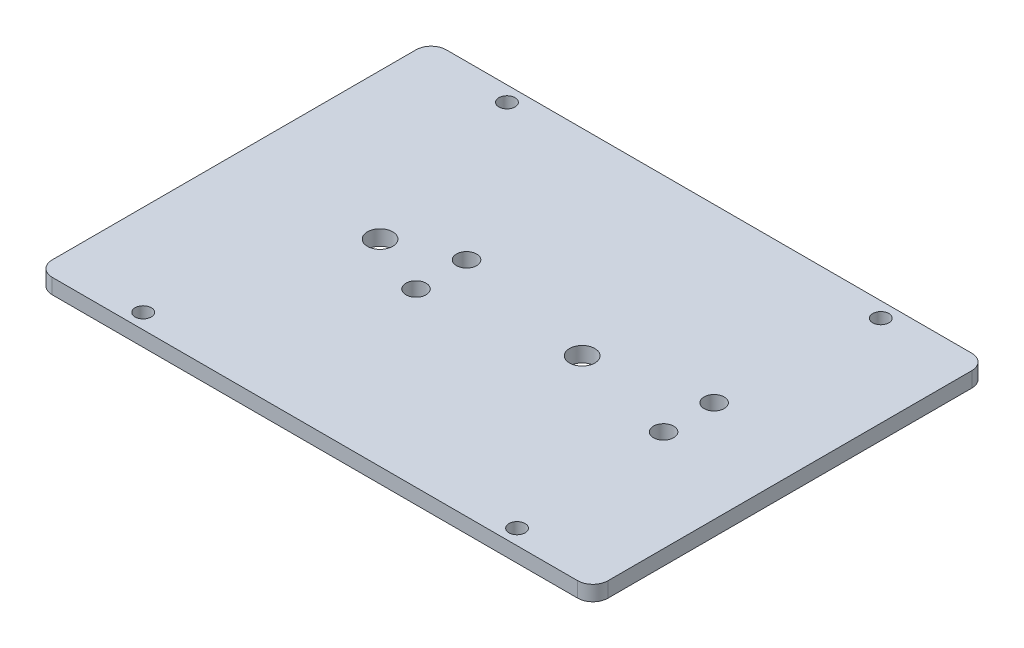
ISO-10303-21;
HEADER;
FILE_DESCRIPTION(('STEP AP214'),'2;1');
FILE_NAME('part.step','',(''),(''),'','','');
FILE_SCHEMA(('AUTOMOTIVE_DESIGN { 1 0 10303 214 1 1 1 1 }'));
ENDSEC;
DATA;
#1=APPLICATION_CONTEXT('core data for automotive mechanical design processes');
#2=APPLICATION_PROTOCOL_DEFINITION('international standard','automotive_design',2000,#1);
#3=PRODUCT_CONTEXT('',#1,'mechanical');
#4=PRODUCT('Part','Part','',(#3));
#5=PRODUCT_RELATED_PRODUCT_CATEGORY('part','',(#4));
#6=PRODUCT_DEFINITION_FORMATION('','',#4);
#7=PRODUCT_DEFINITION_CONTEXT('part definition',#1,'design');
#8=PRODUCT_DEFINITION('design','',#6,#7);
#9=PRODUCT_DEFINITION_SHAPE('','',#8);
#10=(LENGTH_UNIT() NAMED_UNIT(*) SI_UNIT(.MILLI.,.METRE.));
#11=(NAMED_UNIT(*) PLANE_ANGLE_UNIT() SI_UNIT($,.RADIAN.));
#12=(NAMED_UNIT(*) SI_UNIT($,.STERADIAN.) SOLID_ANGLE_UNIT());
#13=UNCERTAINTY_MEASURE_WITH_UNIT(LENGTH_MEASURE(1.E-05),#10,'distance_accuracy_value','');
#14=(GEOMETRIC_REPRESENTATION_CONTEXT(3) GLOBAL_UNCERTAINTY_ASSIGNED_CONTEXT((#13)) GLOBAL_UNIT_ASSIGNED_CONTEXT((#10,
#11,#12)) REPRESENTATION_CONTEXT('',''));
#15=CARTESIAN_POINT('',(0.,0.,0.));
#16=DIRECTION('',(0.,0.,1.));
#17=DIRECTION('',(1.,0.,0.));
#18=AXIS2_PLACEMENT_3D('',#15,#16,#17);
#19=CARTESIAN_POINT('',(0.,3.,0.));
#20=DIRECTION('',(0.,1.,0.));
#21=DIRECTION('',(0.,0.,1.));
#22=AXIS2_PLACEMENT_3D('',#19,#20,#21);
#23=PLANE('',#22);
#24=CARTESIAN_POINT('',(-26.110622523994,3.,0.));
#25=DIRECTION('',(0.,1.,0.));
#26=DIRECTION('',(0.,0.,1.));
#27=AXIS2_PLACEMENT_3D('',#24,#25,#26);
#28=CIRCLE('',#27,2.5);
#29=CARTESIAN_POINT('',(-26.110622523994,3.,2.5));
#30=VERTEX_POINT('',#29);
#31=EDGE_CURVE('E428',#30,#30,#28,.T.);
#32=ORIENTED_EDGE('',*,*,#31,.F.);
#33=EDGE_LOOP('',(#32));
#34=FACE_BOUND('',#33,.T.);
#35=CARTESIAN_POINT('',(13.889377476006,3.,0.));
#36=DIRECTION('',(0.,1.,0.));
#37=DIRECTION('',(0.,0.,1.));
#38=AXIS2_PLACEMENT_3D('',#35,#36,#37);
#39=CIRCLE('',#38,2.5);
#40=CARTESIAN_POINT('',(13.889377476006,3.,2.5));
#41=VERTEX_POINT('',#40);
#42=EDGE_CURVE('E433',#41,#41,#39,.T.);
#43=ORIENTED_EDGE('',*,*,#42,.F.);
#44=EDGE_LOOP('',(#43));
#45=FACE_BOUND('',#44,.T.);
#46=CARTESIAN_POINT('',(-14.,3.,5.));
#47=DIRECTION('',(0.,1.,0.));
#48=DIRECTION('',(0.,0.,-1.));
#49=AXIS2_PLACEMENT_3D('',#46,#47,#48);
#50=CIRCLE('',#49,2.);
#51=CARTESIAN_POINT('',(-14.,3.,3.));
#52=VERTEX_POINT('',#51);
#53=EDGE_CURVE('E445',#52,#52,#50,.T.);
#54=ORIENTED_EDGE('',*,*,#53,.F.);
#55=EDGE_LOOP('',(#54));
#56=FACE_BOUND('',#55,.T.);
#57=CARTESIAN_POINT('',(-14.,3.,-5.));
#58=DIRECTION('',(0.,1.,0.));
#59=DIRECTION('',(0.,0.,1.));
#60=AXIS2_PLACEMENT_3D('',#57,#58,#59);
#61=CIRCLE('',#60,2.);
#62=CARTESIAN_POINT('',(-14.,3.,-3.));
#63=VERTEX_POINT('',#62);
#64=EDGE_CURVE('E450',#63,#63,#61,.T.);
#65=ORIENTED_EDGE('',*,*,#64,.F.);
#66=EDGE_LOOP('',(#65));
#67=FACE_BOUND('',#66,.T.);
#68=CARTESIAN_POINT('',(35.,3.,-5.));
#69=DIRECTION('',(0.,1.,0.));
#70=DIRECTION('',(0.,0.,1.));
#71=AXIS2_PLACEMENT_3D('',#68,#69,#70);
#72=CIRCLE('',#71,2.);
#73=CARTESIAN_POINT('',(35.,3.,-3.));
#74=VERTEX_POINT('',#73);
#75=EDGE_CURVE('E446',#74,#74,#72,.T.);
#76=ORIENTED_EDGE('',*,*,#75,.F.);
#77=EDGE_LOOP('',(#76));
#78=FACE_BOUND('',#77,.T.);
#79=CARTESIAN_POINT('',(35.,3.,5.));
#80=DIRECTION('',(0.,1.,0.));
#81=DIRECTION('',(0.,0.,-1.));
#82=AXIS2_PLACEMENT_3D('',#79,#80,#81);
#83=CIRCLE('',#82,2.);
#84=CARTESIAN_POINT('',(35.,3.,3.));
#85=VERTEX_POINT('',#84);
#86=EDGE_CURVE('E196',#85,#85,#83,.T.);
#87=ORIENTED_EDGE('',*,*,#86,.F.);
#88=EDGE_LOOP('',(#87));
#89=FACE_BOUND('',#88,.T.);
#90=CARTESIAN_POINT('',(37.,3.,36.));
#91=DIRECTION('',(0.,1.,0.));
#92=DIRECTION('',(0.,0.,1.));
#93=AXIS2_PLACEMENT_3D('',#90,#91,#92);
#94=CIRCLE('',#93,1.60000000000001);
#95=CARTESIAN_POINT('',(37.,3.,37.6));
#96=VERTEX_POINT('',#95);
#97=EDGE_CURVE('E221',#96,#96,#94,.T.);
#98=ORIENTED_EDGE('',*,*,#97,.F.);
#99=EDGE_LOOP('',(#98));
#100=FACE_BOUND('',#99,.T.);
#101=CARTESIAN_POINT('',(-37.,3.,-36.));
#102=DIRECTION('',(0.,1.,0.));
#103=DIRECTION('',(0.,0.,1.));
#104=AXIS2_PLACEMENT_3D('',#101,#102,#103);
#105=CIRCLE('',#104,1.6);
#106=CARTESIAN_POINT('',(-37.,3.,-34.4));
#107=VERTEX_POINT('',#106);
#108=EDGE_CURVE('E137',#107,#107,#105,.T.);
#109=ORIENTED_EDGE('',*,*,#108,.F.);
#110=EDGE_LOOP('',(#109));
#111=FACE_BOUND('',#110,.T.);
#112=DIRECTION('',(-1.,0.,0.));
#113=VECTOR('',#112,1.);
#114=CARTESIAN_POINT('',(55.,3.,-39.));
#115=LINE('',#114,#113);
#116=CARTESIAN_POINT('',(52.,3.,-39.));
#117=VERTEX_POINT('',#116);
#118=CARTESIAN_POINT('',(-52.,3.,-39.));
#119=VERTEX_POINT('',#118);
#120=EDGE_CURVE('E148',#117,#119,#115,.T.);
#121=ORIENTED_EDGE('',*,*,#120,.T.);
#122=CARTESIAN_POINT('',(-52.,3.,-36.));
#123=DIRECTION('',(0.,1.,0.));
#124=DIRECTION('',(0.,0.,1.));
#125=AXIS2_PLACEMENT_3D('',#122,#123,#124);
#126=CIRCLE('',#125,3.);
#127=CARTESIAN_POINT('',(-55.,3.,-36.));
#128=VERTEX_POINT('',#127);
#129=EDGE_CURVE('E178',#119,#128,#126,.T.);
#130=ORIENTED_EDGE('',*,*,#129,.T.);
#131=DIRECTION('',(0.,0.,1.));
#132=VECTOR('',#131,1.);
#133=CARTESIAN_POINT('',(-55.,3.,39.));
#134=LINE('',#133,#132);
#135=CARTESIAN_POINT('',(-55.,3.,36.));
#136=VERTEX_POINT('',#135);
#137=EDGE_CURVE('E127',#128,#136,#134,.T.);
#138=ORIENTED_EDGE('',*,*,#137,.T.);
#139=CARTESIAN_POINT('',(-52.,3.,36.));
#140=DIRECTION('',(0.,1.,0.));
#141=DIRECTION('',(0.,0.,1.));
#142=AXIS2_PLACEMENT_3D('',#139,#140,#141);
#143=CIRCLE('',#142,3.);
#144=CARTESIAN_POINT('',(-52.,3.,39.));
#145=VERTEX_POINT('',#144);
#146=EDGE_CURVE('E175',#136,#145,#143,.T.);
#147=ORIENTED_EDGE('',*,*,#146,.T.);
#148=DIRECTION('',(1.,0.,0.));
#149=VECTOR('',#148,1.);
#150=CARTESIAN_POINT('',(55.,3.,39.));
#151=LINE('',#150,#149);
#152=CARTESIAN_POINT('',(52.,3.,39.));
#153=VERTEX_POINT('',#152);
#154=EDGE_CURVE('E241',#145,#153,#151,.T.);
#155=ORIENTED_EDGE('',*,*,#154,.T.);
#156=CARTESIAN_POINT('',(52.,3.,36.));
#157=DIRECTION('',(0.,1.,0.));
#158=DIRECTION('',(0.,0.,1.));
#159=AXIS2_PLACEMENT_3D('',#156,#157,#158);
#160=CIRCLE('',#159,3.);
#161=CARTESIAN_POINT('',(55.,3.,36.));
#162=VERTEX_POINT('',#161);
#163=EDGE_CURVE('E61',#153,#162,#160,.T.);
#164=ORIENTED_EDGE('',*,*,#163,.T.);
#165=DIRECTION('',(0.,0.,-1.));
#166=VECTOR('',#165,1.);
#167=CARTESIAN_POINT('',(55.,3.,39.));
#168=LINE('',#167,#166);
#169=CARTESIAN_POINT('',(55.,3.,-36.));
#170=VERTEX_POINT('',#169);
#171=EDGE_CURVE('E243',#162,#170,#168,.T.);
#172=ORIENTED_EDGE('',*,*,#171,.T.);
#173=CARTESIAN_POINT('',(52.,3.,-36.));
#174=DIRECTION('',(0.,1.,0.));
#175=DIRECTION('',(0.,0.,1.));
#176=AXIS2_PLACEMENT_3D('',#173,#174,#175);
#177=CIRCLE('',#176,3.);
#178=EDGE_CURVE('E172',#170,#117,#177,.T.);
#179=ORIENTED_EDGE('',*,*,#178,.T.);
#180=EDGE_LOOP('',(#121,#130,#138,#147,#155,#164,#172,#179));
#181=FACE_BOUND('',#180,.T.);
#182=CARTESIAN_POINT('',(37.,3.,-36.));
#183=DIRECTION('',(0.,1.,0.));
#184=DIRECTION('',(0.,0.,1.));
#185=AXIS2_PLACEMENT_3D('',#182,#183,#184);
#186=CIRCLE('',#185,1.60000000000001);
#187=CARTESIAN_POINT('',(37.,3.,-34.4));
#188=VERTEX_POINT('',#187);
#189=EDGE_CURVE('E229',#188,#188,#186,.T.);
#190=ORIENTED_EDGE('',*,*,#189,.F.);
#191=EDGE_LOOP('',(#190));
#192=FACE_BOUND('',#191,.T.);
#193=CARTESIAN_POINT('',(-37.,3.,36.));
#194=DIRECTION('',(0.,1.,0.));
#195=DIRECTION('',(0.,0.,1.));
#196=AXIS2_PLACEMENT_3D('',#193,#194,#195);
#197=CIRCLE('',#196,1.6);
#198=CARTESIAN_POINT('',(-37.,3.,37.6));
#199=VERTEX_POINT('',#198);
#200=EDGE_CURVE('E211',#199,#199,#197,.T.);
#201=ORIENTED_EDGE('',*,*,#200,.F.);
#202=EDGE_LOOP('',(#201));
#203=FACE_BOUND('',#202,.T.);
#204=ADVANCED_FACE('F38',(#34,#45,#56,#67,#78,#89,#100,#111,#181,#192,#203),#23,.T.);
#205=CARTESIAN_POINT('',(0.,0.,0.));
#206=DIRECTION('',(0.,1.,0.));
#207=DIRECTION('',(0.,0.,1.));
#208=AXIS2_PLACEMENT_3D('',#205,#206,#207);
#209=PLANE('',#208);
#210=CARTESIAN_POINT('',(-26.110622523994,0.,0.));
#211=DIRECTION('',(0.,-1.,0.));
#212=DIRECTION('',(0.,0.,-1.));
#213=AXIS2_PLACEMENT_3D('',#210,#211,#212);
#214=CIRCLE('',#213,2.5);
#215=CARTESIAN_POINT('',(-26.110622523994,0.,-2.5));
#216=VERTEX_POINT('',#215);
#217=EDGE_CURVE('E431',#216,#216,#214,.T.);
#218=ORIENTED_EDGE('',*,*,#217,.F.);
#219=EDGE_LOOP('',(#218));
#220=FACE_BOUND('',#219,.T.);
#221=CARTESIAN_POINT('',(13.889377476006,0.,0.));
#222=DIRECTION('',(0.,-1.,0.));
#223=DIRECTION('',(0.,0.,-1.));
#224=AXIS2_PLACEMENT_3D('',#221,#222,#223);
#225=CIRCLE('',#224,2.5);
#226=CARTESIAN_POINT('',(13.889377476006,0.,-2.5));
#227=VERTEX_POINT('',#226);
#228=EDGE_CURVE('E434',#227,#227,#225,.T.);
#229=ORIENTED_EDGE('',*,*,#228,.F.);
#230=EDGE_LOOP('',(#229));
#231=FACE_BOUND('',#230,.T.);
#232=CARTESIAN_POINT('',(-14.,0.,5.));
#233=DIRECTION('',(0.,1.,0.));
#234=DIRECTION('',(0.,0.,1.));
#235=AXIS2_PLACEMENT_3D('',#232,#233,#234);
#236=CIRCLE('',#235,2.);
#237=CARTESIAN_POINT('',(-14.,0.,7.));
#238=VERTEX_POINT('',#237);
#239=EDGE_CURVE('E42',#238,#238,#236,.T.);
#240=ORIENTED_EDGE('',*,*,#239,.T.);
#241=EDGE_LOOP('',(#240));
#242=FACE_BOUND('',#241,.T.);
#243=CARTESIAN_POINT('',(-14.,0.,-5.));
#244=DIRECTION('',(0.,1.,0.));
#245=DIRECTION('',(0.,0.,1.));
#246=AXIS2_PLACEMENT_3D('',#243,#244,#245);
#247=CIRCLE('',#246,2.);
#248=CARTESIAN_POINT('',(-14.,0.,-3.));
#249=VERTEX_POINT('',#248);
#250=EDGE_CURVE('E199',#249,#249,#247,.T.);
#251=ORIENTED_EDGE('',*,*,#250,.T.);
#252=EDGE_LOOP('',(#251));
#253=FACE_BOUND('',#252,.T.);
#254=CARTESIAN_POINT('',(35.,0.,-5.));
#255=DIRECTION('',(0.,1.,0.));
#256=DIRECTION('',(0.,0.,1.));
#257=AXIS2_PLACEMENT_3D('',#254,#255,#256);
#258=CIRCLE('',#257,2.);
#259=CARTESIAN_POINT('',(35.,0.,-3.));
#260=VERTEX_POINT('',#259);
#261=EDGE_CURVE('E195',#260,#260,#258,.T.);
#262=ORIENTED_EDGE('',*,*,#261,.T.);
#263=EDGE_LOOP('',(#262));
#264=FACE_BOUND('',#263,.T.);
#265=CARTESIAN_POINT('',(35.,0.,5.));
#266=DIRECTION('',(0.,1.,0.));
#267=DIRECTION('',(0.,0.,1.));
#268=AXIS2_PLACEMENT_3D('',#265,#266,#267);
#269=CIRCLE('',#268,2.);
#270=CARTESIAN_POINT('',(35.,0.,7.));
#271=VERTEX_POINT('',#270);
#272=EDGE_CURVE('E191',#271,#271,#269,.T.);
#273=ORIENTED_EDGE('',*,*,#272,.T.);
#274=EDGE_LOOP('',(#273));
#275=FACE_BOUND('',#274,.T.);
#276=DIRECTION('',(0.,0.,1.));
#277=VECTOR('',#276,1.);
#278=CARTESIAN_POINT('',(-55.,0.,39.));
#279=LINE('',#278,#277);
#280=CARTESIAN_POINT('',(-55.,0.,-36.));
#281=VERTEX_POINT('',#280);
#282=CARTESIAN_POINT('',(-55.,0.,36.));
#283=VERTEX_POINT('',#282);
#284=EDGE_CURVE('E124',#281,#283,#279,.T.);
#285=ORIENTED_EDGE('',*,*,#284,.F.);
#286=CARTESIAN_POINT('',(-52.,0.,-36.));
#287=DIRECTION('',(0.,1.,0.));
#288=DIRECTION('',(0.,0.,1.));
#289=AXIS2_PLACEMENT_3D('',#286,#287,#288);
#290=CIRCLE('',#289,3.);
#291=CARTESIAN_POINT('',(-52.,0.,-39.));
#292=VERTEX_POINT('',#291);
#293=EDGE_CURVE('E106',#281,#292,#290,.F.);
#294=ORIENTED_EDGE('',*,*,#293,.T.);
#295=DIRECTION('',(-1.,0.,0.));
#296=VECTOR('',#295,1.);
#297=CARTESIAN_POINT('',(55.,0.,-39.));
#298=LINE('',#297,#296);
#299=CARTESIAN_POINT('',(52.,0.,-39.));
#300=VERTEX_POINT('',#299);
#301=EDGE_CURVE('E153',#300,#292,#298,.T.);
#302=ORIENTED_EDGE('',*,*,#301,.F.);
#303=CARTESIAN_POINT('',(52.,0.,-36.));
#304=DIRECTION('',(0.,1.,0.));
#305=DIRECTION('',(0.,0.,1.));
#306=AXIS2_PLACEMENT_3D('',#303,#304,#305);
#307=CIRCLE('',#306,3.);
#308=CARTESIAN_POINT('',(55.,0.,-36.));
#309=VERTEX_POINT('',#308);
#310=EDGE_CURVE('E160',#300,#309,#307,.F.);
#311=ORIENTED_EDGE('',*,*,#310,.T.);
#312=DIRECTION('',(0.,0.,-1.));
#313=VECTOR('',#312,1.);
#314=CARTESIAN_POINT('',(55.,0.,39.));
#315=LINE('',#314,#313);
#316=CARTESIAN_POINT('',(55.,0.,36.));
#317=VERTEX_POINT('',#316);
#318=EDGE_CURVE('E142',#317,#309,#315,.T.);
#319=ORIENTED_EDGE('',*,*,#318,.F.);
#320=CARTESIAN_POINT('',(52.,0.,36.));
#321=DIRECTION('',(0.,1.,0.));
#322=DIRECTION('',(0.,0.,1.));
#323=AXIS2_PLACEMENT_3D('',#320,#321,#322);
#324=CIRCLE('',#323,3.);
#325=CARTESIAN_POINT('',(52.,0.,39.));
#326=VERTEX_POINT('',#325);
#327=EDGE_CURVE('E129',#317,#326,#324,.F.);
#328=ORIENTED_EDGE('',*,*,#327,.T.);
#329=DIRECTION('',(1.,0.,0.));
#330=VECTOR('',#329,1.);
#331=CARTESIAN_POINT('',(55.,0.,39.));
#332=LINE('',#331,#330);
#333=CARTESIAN_POINT('',(-52.,0.,39.));
#334=VERTEX_POINT('',#333);
#335=EDGE_CURVE('E136',#334,#326,#332,.T.);
#336=ORIENTED_EDGE('',*,*,#335,.F.);
#337=CARTESIAN_POINT('',(-52.,0.,36.));
#338=DIRECTION('',(0.,1.,0.));
#339=DIRECTION('',(0.,0.,1.));
#340=AXIS2_PLACEMENT_3D('',#337,#338,#339);
#341=CIRCLE('',#340,3.);
#342=EDGE_CURVE('E118',#334,#283,#341,.F.);
#343=ORIENTED_EDGE('',*,*,#342,.T.);
#344=EDGE_LOOP('',(#285,#294,#302,#311,#319,#328,#336,#343));
#345=FACE_BOUND('',#344,.T.);
#346=CARTESIAN_POINT('',(-37.,0.,-36.));
#347=DIRECTION('',(0.,1.,0.));
#348=DIRECTION('',(0.,0.,1.));
#349=AXIS2_PLACEMENT_3D('',#346,#347,#348);
#350=CIRCLE('',#349,1.6);
#351=CARTESIAN_POINT('',(-37.,0.,-34.4));
#352=VERTEX_POINT('',#351);
#353=EDGE_CURVE('E145',#352,#352,#350,.T.);
#354=ORIENTED_EDGE('',*,*,#353,.T.);
#355=EDGE_LOOP('',(#354));
#356=FACE_BOUND('',#355,.T.);
#357=CARTESIAN_POINT('',(37.,0.,-36.));
#358=DIRECTION('',(0.,1.,0.));
#359=DIRECTION('',(0.,0.,1.));
#360=AXIS2_PLACEMENT_3D('',#357,#358,#359);
#361=CIRCLE('',#360,1.60000000000001);
#362=CARTESIAN_POINT('',(37.,0.,-34.4));
#363=VERTEX_POINT('',#362);
#364=EDGE_CURVE('E225',#363,#363,#361,.T.);
#365=ORIENTED_EDGE('',*,*,#364,.T.);
#366=EDGE_LOOP('',(#365));
#367=FACE_BOUND('',#366,.T.);
#368=CARTESIAN_POINT('',(37.,0.,36.));
#369=DIRECTION('',(0.,1.,0.));
#370=DIRECTION('',(0.,0.,1.));
#371=AXIS2_PLACEMENT_3D('',#368,#369,#370);
#372=CIRCLE('',#371,1.60000000000001);
#373=CARTESIAN_POINT('',(37.,0.,37.6));
#374=VERTEX_POINT('',#373);
#375=EDGE_CURVE('E217',#374,#374,#372,.T.);
#376=ORIENTED_EDGE('',*,*,#375,.T.);
#377=EDGE_LOOP('',(#376));
#378=FACE_BOUND('',#377,.T.);
#379=CARTESIAN_POINT('',(-37.,0.,36.));
#380=DIRECTION('',(0.,1.,0.));
#381=DIRECTION('',(0.,0.,1.));
#382=AXIS2_PLACEMENT_3D('',#379,#380,#381);
#383=CIRCLE('',#382,1.6);
#384=CARTESIAN_POINT('',(-37.,0.,37.6));
#385=VERTEX_POINT('',#384);
#386=EDGE_CURVE('E206',#385,#385,#383,.T.);
#387=ORIENTED_EDGE('',*,*,#386,.T.);
#388=EDGE_LOOP('',(#387));
#389=FACE_BOUND('',#388,.T.);
#390=ADVANCED_FACE('F132',(#220,#231,#242,#253,#264,#275,#345,#356,#367,#378,#389),#209,.F.);
#391=CARTESIAN_POINT('',(-55.,3.,39.));
#392=DIRECTION('',(1.,0.,0.));
#393=DIRECTION('',(0.,0.,-1.));
#394=AXIS2_PLACEMENT_3D('',#391,#392,#393);
#395=PLANE('',#394);
#396=ORIENTED_EDGE('',*,*,#137,.F.);
#397=DIRECTION('',(0.,-1.,0.));
#398=VECTOR('',#397,1.);
#399=CARTESIAN_POINT('',(-55.,3.,-36.));
#400=LINE('',#399,#398);
#401=EDGE_CURVE('E110',#128,#281,#400,.T.);
#402=ORIENTED_EDGE('',*,*,#401,.T.);
#403=ORIENTED_EDGE('',*,*,#284,.T.);
#404=DIRECTION('',(0.,-1.,0.));
#405=VECTOR('',#404,1.);
#406=CARTESIAN_POINT('',(-55.,3.,36.));
#407=LINE('',#406,#405);
#408=EDGE_CURVE('E130',#283,#136,#407,.F.);
#409=ORIENTED_EDGE('',*,*,#408,.T.);
#410=EDGE_LOOP('',(#396,#402,#403,#409));
#411=FACE_BOUND('',#410,.T.);
#412=ADVANCED_FACE('F123',(#411),#395,.F.);
#413=CARTESIAN_POINT('',(55.,3.,39.));
#414=DIRECTION('',(0.,0.,-1.));
#415=DIRECTION('',(-1.,0.,0.));
#416=AXIS2_PLACEMENT_3D('',#413,#414,#415);
#417=PLANE('',#416);
#418=ORIENTED_EDGE('',*,*,#154,.F.);
#419=DIRECTION('',(0.,-1.,0.));
#420=VECTOR('',#419,1.);
#421=CARTESIAN_POINT('',(-52.,3.,39.));
#422=LINE('',#421,#420);
#423=EDGE_CURVE('E184',#145,#334,#422,.T.);
#424=ORIENTED_EDGE('',*,*,#423,.T.);
#425=ORIENTED_EDGE('',*,*,#335,.T.);
#426=DIRECTION('',(0.,-1.,0.));
#427=VECTOR('',#426,1.);
#428=CARTESIAN_POINT('',(52.,3.,39.));
#429=LINE('',#428,#427);
#430=EDGE_CURVE('E181',#326,#153,#429,.F.);
#431=ORIENTED_EDGE('',*,*,#430,.T.);
#432=EDGE_LOOP('',(#418,#424,#425,#431));
#433=FACE_BOUND('',#432,.T.);
#434=ADVANCED_FACE('F262',(#433),#417,.F.);
#435=CARTESIAN_POINT('',(55.,3.,39.));
#436=DIRECTION('',(-1.,0.,0.));
#437=DIRECTION('',(0.,0.,1.));
#438=AXIS2_PLACEMENT_3D('',#435,#436,#437);
#439=PLANE('',#438);
#440=ORIENTED_EDGE('',*,*,#318,.T.);
#441=DIRECTION('',(0.,-1.,0.));
#442=VECTOR('',#441,1.);
#443=CARTESIAN_POINT('',(55.,3.,-36.));
#444=LINE('',#443,#442);
#445=EDGE_CURVE('E11',#309,#170,#444,.F.);
#446=ORIENTED_EDGE('',*,*,#445,.T.);
#447=ORIENTED_EDGE('',*,*,#171,.F.);
#448=DIRECTION('',(0.,-1.,0.));
#449=VECTOR('',#448,1.);
#450=CARTESIAN_POINT('',(55.,3.,36.));
#451=LINE('',#450,#449);
#452=EDGE_CURVE('E48',#162,#317,#451,.T.);
#453=ORIENTED_EDGE('',*,*,#452,.T.);
#454=EDGE_LOOP('',(#440,#446,#447,#453));
#455=FACE_BOUND('',#454,.T.);
#456=ADVANCED_FACE('F256',(#455),#439,.F.);
#457=CARTESIAN_POINT('',(55.,3.,-39.));
#458=DIRECTION('',(0.,0.,1.));
#459=DIRECTION('',(1.,0.,0.));
#460=AXIS2_PLACEMENT_3D('',#457,#458,#459);
#461=PLANE('',#460);
#462=ORIENTED_EDGE('',*,*,#301,.T.);
#463=DIRECTION('',(0.,-1.,0.));
#464=VECTOR('',#463,1.);
#465=CARTESIAN_POINT('',(-52.,3.,-39.));
#466=LINE('',#465,#464);
#467=EDGE_CURVE('E111',#292,#119,#466,.F.);
#468=ORIENTED_EDGE('',*,*,#467,.T.);
#469=ORIENTED_EDGE('',*,*,#120,.F.);
#470=DIRECTION('',(0.,-1.,0.));
#471=VECTOR('',#470,1.);
#472=CARTESIAN_POINT('',(52.,3.,-39.));
#473=LINE('',#472,#471);
#474=EDGE_CURVE('E117',#117,#300,#473,.T.);
#475=ORIENTED_EDGE('',*,*,#474,.T.);
#476=EDGE_LOOP('',(#462,#468,#469,#475));
#477=FACE_BOUND('',#476,.T.);
#478=ADVANCED_FACE('F252',(#477),#461,.F.);
#479=CARTESIAN_POINT('',(-37.,3.,-36.));
#480=DIRECTION('',(0.,-1.,0.));
#481=DIRECTION('',(0.,0.,-1.));
#482=AXIS2_PLACEMENT_3D('',#479,#480,#481);
#483=CYLINDRICAL_SURFACE('',#482,1.6);
#484=ORIENTED_EDGE('',*,*,#108,.T.);
#485=EDGE_LOOP('',(#484));
#486=FACE_BOUND('',#485,.T.);
#487=ORIENTED_EDGE('',*,*,#353,.F.);
#488=EDGE_LOOP('',(#487));
#489=FACE_BOUND('',#488,.T.);
#490=ADVANCED_FACE('F287',(#486,#489),#483,.F.);
#491=CARTESIAN_POINT('',(37.,3.,-36.));
#492=DIRECTION('',(0.,-1.,0.));
#493=DIRECTION('',(0.,0.,-1.));
#494=AXIS2_PLACEMENT_3D('',#491,#492,#493);
#495=CYLINDRICAL_SURFACE('',#494,1.60000000000001);
#496=ORIENTED_EDGE('',*,*,#189,.T.);
#497=EDGE_LOOP('',(#496));
#498=FACE_BOUND('',#497,.T.);
#499=ORIENTED_EDGE('',*,*,#364,.F.);
#500=EDGE_LOOP('',(#499));
#501=FACE_BOUND('',#500,.T.);
#502=ADVANCED_FACE('F322',(#498,#501),#495,.F.);
#503=CARTESIAN_POINT('',(37.,3.,36.));
#504=DIRECTION('',(0.,-1.,0.));
#505=DIRECTION('',(0.,0.,-1.));
#506=AXIS2_PLACEMENT_3D('',#503,#504,#505);
#507=CYLINDRICAL_SURFACE('',#506,1.60000000000001);
#508=ORIENTED_EDGE('',*,*,#97,.T.);
#509=EDGE_LOOP('',(#508));
#510=FACE_BOUND('',#509,.T.);
#511=ORIENTED_EDGE('',*,*,#375,.F.);
#512=EDGE_LOOP('',(#511));
#513=FACE_BOUND('',#512,.T.);
#514=ADVANCED_FACE('F329',(#510,#513),#507,.F.);
#515=CARTESIAN_POINT('',(-37.,3.,36.));
#516=DIRECTION('',(0.,-1.,0.));
#517=DIRECTION('',(0.,0.,-1.));
#518=AXIS2_PLACEMENT_3D('',#515,#516,#517);
#519=CYLINDRICAL_SURFACE('',#518,1.6);
#520=ORIENTED_EDGE('',*,*,#200,.T.);
#521=EDGE_LOOP('',(#520));
#522=FACE_BOUND('',#521,.T.);
#523=ORIENTED_EDGE('',*,*,#386,.F.);
#524=EDGE_LOOP('',(#523));
#525=FACE_BOUND('',#524,.T.);
#526=ADVANCED_FACE('F273',(#522,#525),#519,.F.);
#527=CARTESIAN_POINT('',(-52.,3.,-36.));
#528=DIRECTION('',(0.,-1.,0.));
#529=DIRECTION('',(0.,0.,-1.));
#530=AXIS2_PLACEMENT_3D('',#527,#528,#529);
#531=CYLINDRICAL_SURFACE('',#530,3.);
#532=ORIENTED_EDGE('',*,*,#129,.F.);
#533=ORIENTED_EDGE('',*,*,#467,.F.);
#534=ORIENTED_EDGE('',*,*,#293,.F.);
#535=ORIENTED_EDGE('',*,*,#401,.F.);
#536=EDGE_LOOP('',(#532,#533,#534,#535));
#537=FACE_BOUND('',#536,.T.);
#538=ADVANCED_FACE('F109',(#537),#531,.T.);
#539=CARTESIAN_POINT('',(-52.,3.,36.));
#540=DIRECTION('',(0.,-1.,0.));
#541=DIRECTION('',(0.,0.,-1.));
#542=AXIS2_PLACEMENT_3D('',#539,#540,#541);
#543=CYLINDRICAL_SURFACE('',#542,3.);
#544=ORIENTED_EDGE('',*,*,#146,.F.);
#545=ORIENTED_EDGE('',*,*,#408,.F.);
#546=ORIENTED_EDGE('',*,*,#342,.F.);
#547=ORIENTED_EDGE('',*,*,#423,.F.);
#548=EDGE_LOOP('',(#544,#545,#546,#547));
#549=FACE_BOUND('',#548,.T.);
#550=ADVANCED_FACE('F266',(#549),#543,.T.);
#551=CARTESIAN_POINT('',(52.,3.,-36.));
#552=DIRECTION('',(0.,-1.,0.));
#553=DIRECTION('',(0.,0.,-1.));
#554=AXIS2_PLACEMENT_3D('',#551,#552,#553);
#555=CYLINDRICAL_SURFACE('',#554,3.);
#556=ORIENTED_EDGE('',*,*,#178,.F.);
#557=ORIENTED_EDGE('',*,*,#445,.F.);
#558=ORIENTED_EDGE('',*,*,#310,.F.);
#559=ORIENTED_EDGE('',*,*,#474,.F.);
#560=EDGE_LOOP('',(#556,#557,#558,#559));
#561=FACE_BOUND('',#560,.T.);
#562=ADVANCED_FACE('F254',(#561),#555,.T.);
#563=CARTESIAN_POINT('',(52.,3.,36.));
#564=DIRECTION('',(0.,-1.,0.));
#565=DIRECTION('',(0.,0.,-1.));
#566=AXIS2_PLACEMENT_3D('',#563,#564,#565);
#567=CYLINDRICAL_SURFACE('',#566,3.);
#568=ORIENTED_EDGE('',*,*,#163,.F.);
#569=ORIENTED_EDGE('',*,*,#430,.F.);
#570=ORIENTED_EDGE('',*,*,#327,.F.);
#571=ORIENTED_EDGE('',*,*,#452,.F.);
#572=EDGE_LOOP('',(#568,#569,#570,#571));
#573=FACE_BOUND('',#572,.T.);
#574=ADVANCED_FACE('F40',(#573),#567,.T.);
#575=CARTESIAN_POINT('',(35.,-7.,5.));
#576=DIRECTION('',(0.,1.,0.));
#577=DIRECTION('',(0.,0.,1.));
#578=AXIS2_PLACEMENT_3D('',#575,#576,#577);
#579=CYLINDRICAL_SURFACE('',#578,2.);
#580=ORIENTED_EDGE('',*,*,#86,.T.);
#581=EDGE_LOOP('',(#580));
#582=FACE_BOUND('',#581,.T.);
#583=ORIENTED_EDGE('',*,*,#272,.F.);
#584=EDGE_LOOP('',(#583));
#585=FACE_BOUND('',#584,.T.);
#586=ADVANCED_FACE('F365',(#582,#585),#579,.F.);
#587=CARTESIAN_POINT('',(35.,-7.,-5.));
#588=DIRECTION('',(0.,1.,0.));
#589=DIRECTION('',(0.,0.,1.));
#590=AXIS2_PLACEMENT_3D('',#587,#588,#589);
#591=CYLINDRICAL_SURFACE('',#590,2.);
#592=ORIENTED_EDGE('',*,*,#75,.T.);
#593=EDGE_LOOP('',(#592));
#594=FACE_BOUND('',#593,.T.);
#595=ORIENTED_EDGE('',*,*,#261,.F.);
#596=EDGE_LOOP('',(#595));
#597=FACE_BOUND('',#596,.T.);
#598=ADVANCED_FACE('F373',(#594,#597),#591,.F.);
#599=CARTESIAN_POINT('',(-14.,-7.,-5.));
#600=DIRECTION('',(0.,1.,0.));
#601=DIRECTION('',(0.,0.,1.));
#602=AXIS2_PLACEMENT_3D('',#599,#600,#601);
#603=CYLINDRICAL_SURFACE('',#602,2.);
#604=ORIENTED_EDGE('',*,*,#64,.T.);
#605=EDGE_LOOP('',(#604));
#606=FACE_BOUND('',#605,.T.);
#607=ORIENTED_EDGE('',*,*,#250,.F.);
#608=EDGE_LOOP('',(#607));
#609=FACE_BOUND('',#608,.T.);
#610=ADVANCED_FACE('F383',(#606,#609),#603,.F.);
#611=CARTESIAN_POINT('',(-14.,-7.,5.));
#612=DIRECTION('',(0.,1.,0.));
#613=DIRECTION('',(0.,0.,1.));
#614=AXIS2_PLACEMENT_3D('',#611,#612,#613);
#615=CYLINDRICAL_SURFACE('',#614,2.);
#616=ORIENTED_EDGE('',*,*,#53,.T.);
#617=EDGE_LOOP('',(#616));
#618=FACE_BOUND('',#617,.T.);
#619=ORIENTED_EDGE('',*,*,#239,.F.);
#620=EDGE_LOOP('',(#619));
#621=FACE_BOUND('',#620,.T.);
#622=ADVANCED_FACE('F392',(#618,#621),#615,.F.);
#623=CARTESIAN_POINT('',(13.889377476006,10.,0.));
#624=DIRECTION('',(0.,-1.,0.));
#625=DIRECTION('',(0.,0.,-1.));
#626=AXIS2_PLACEMENT_3D('',#623,#624,#625);
#627=CYLINDRICAL_SURFACE('',#626,2.5);
#628=ORIENTED_EDGE('',*,*,#42,.T.);
#629=EDGE_LOOP('',(#628));
#630=FACE_BOUND('',#629,.T.);
#631=ORIENTED_EDGE('',*,*,#228,.T.);
#632=EDGE_LOOP('',(#631));
#633=FACE_BOUND('',#632,.T.);
#634=ADVANCED_FACE('F401',(#630,#633),#627,.F.);
#635=CARTESIAN_POINT('',(-26.110622523994,10.,0.));
#636=DIRECTION('',(0.,-1.,0.));
#637=DIRECTION('',(0.,0.,-1.));
#638=AXIS2_PLACEMENT_3D('',#635,#636,#637);
#639=CYLINDRICAL_SURFACE('',#638,2.5);
#640=ORIENTED_EDGE('',*,*,#31,.T.);
#641=EDGE_LOOP('',(#640));
#642=FACE_BOUND('',#641,.T.);
#643=ORIENTED_EDGE('',*,*,#217,.T.);
#644=EDGE_LOOP('',(#643));
#645=FACE_BOUND('',#644,.T.);
#646=ADVANCED_FACE('F412',(#642,#645),#639,.F.);
#647=CLOSED_SHELL('',(#204,#390,#412,#434,#456,#478,#490,#502,#514,#526,#538,#550,#562,#574,
#586,#598,#610,#622,#634,#646));
#648=MANIFOLD_SOLID_BREP('B2',#647);
#649=ADVANCED_BREP_SHAPE_REPRESENTATION('',(#18,#648),#14);
#650=SHAPE_DEFINITION_REPRESENTATION(#9,#649);
ENDSEC;
END-ISO-10303-21;
